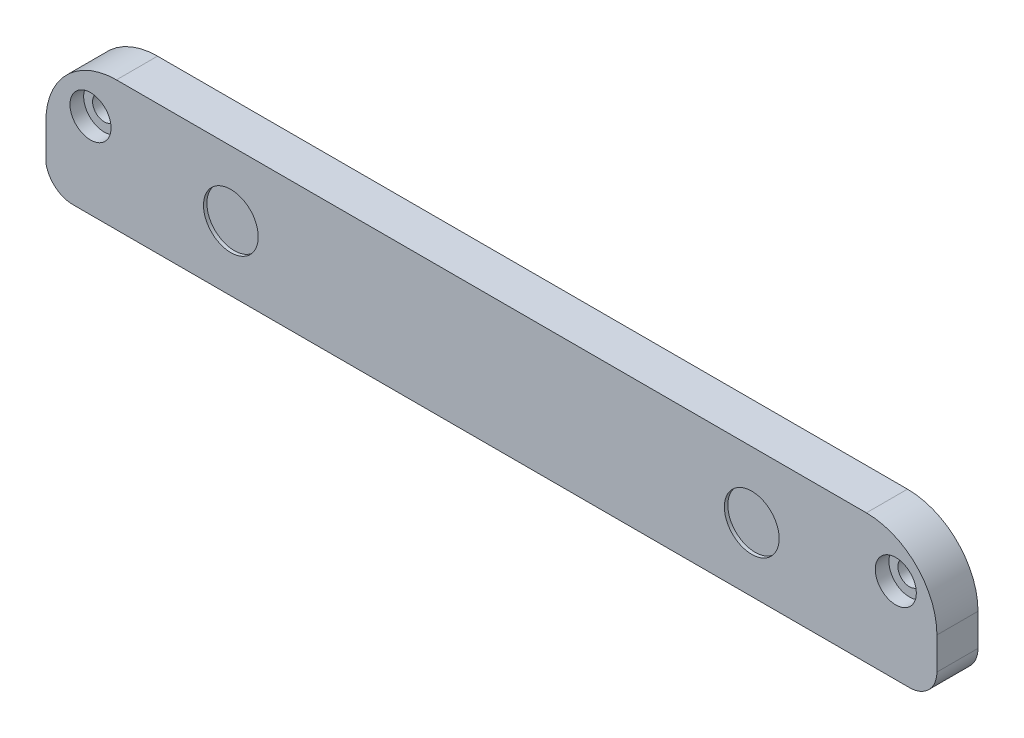
ISO-10303-21;
HEADER;
FILE_DESCRIPTION(('STEP AP214'),'2;1');
FILE_NAME('part.step','',(''),(''),'','','');
FILE_SCHEMA(('AUTOMOTIVE_DESIGN { 1 0 10303 214 1 1 1 1 }'));
ENDSEC;
DATA;
#1=APPLICATION_CONTEXT('core data for automotive mechanical design processes');
#2=APPLICATION_PROTOCOL_DEFINITION('international standard','automotive_design',2000,#1);
#3=PRODUCT_CONTEXT('',#1,'mechanical');
#4=PRODUCT('Part','Part','',(#3));
#5=PRODUCT_RELATED_PRODUCT_CATEGORY('part','',(#4));
#6=PRODUCT_DEFINITION_FORMATION('','',#4);
#7=PRODUCT_DEFINITION_CONTEXT('part definition',#1,'design');
#8=PRODUCT_DEFINITION('design','',#6,#7);
#9=PRODUCT_DEFINITION_SHAPE('','',#8);
#10=(LENGTH_UNIT() NAMED_UNIT(*) SI_UNIT(.MILLI.,.METRE.));
#11=(NAMED_UNIT(*) PLANE_ANGLE_UNIT() SI_UNIT($,.RADIAN.));
#12=(NAMED_UNIT(*) SI_UNIT($,.STERADIAN.) SOLID_ANGLE_UNIT());
#13=UNCERTAINTY_MEASURE_WITH_UNIT(LENGTH_MEASURE(1.E-05),#10,'distance_accuracy_value','');
#14=(GEOMETRIC_REPRESENTATION_CONTEXT(3) GLOBAL_UNCERTAINTY_ASSIGNED_CONTEXT((#13)) GLOBAL_UNIT_ASSIGNED_CONTEXT((#10,
#11,#12)) REPRESENTATION_CONTEXT('',''));
#15=CARTESIAN_POINT('',(0.,0.,0.));
#16=DIRECTION('',(0.,0.,1.));
#17=DIRECTION('',(1.,0.,0.));
#18=AXIS2_PLACEMENT_3D('',#15,#16,#17);
#19=CARTESIAN_POINT('',(-172.847423140113,-48.0905,6.));
#20=DIRECTION('',(0.,0.,-1.));
#21=DIRECTION('',(-1.,0.,0.));
#22=AXIS2_PLACEMENT_3D('',#19,#20,#21);
#23=CYLINDRICAL_SURFACE('',#22,1.70000000000001);
#24=CARTESIAN_POINT('',(-172.847423140113,-48.0905,0.));
#25=DIRECTION('',(0.,0.,1.));
#26=DIRECTION('',(1.,0.,0.));
#27=AXIS2_PLACEMENT_3D('',#24,#25,#26);
#28=CIRCLE('',#27,1.70000000000001);
#29=CARTESIAN_POINT('',(-171.147423140113,-48.0905,0.));
#30=VERTEX_POINT('',#29);
#31=EDGE_CURVE('E141',#30,#30,#28,.T.);
#32=ORIENTED_EDGE('',*,*,#31,.F.);
#33=EDGE_LOOP('',(#32));
#34=FACE_BOUND('',#33,.T.);
#35=CARTESIAN_POINT('',(-172.847423140113,-48.0905,4.));
#36=DIRECTION('',(0.,0.,1.));
#37=DIRECTION('',(1.,0.,0.));
#38=AXIS2_PLACEMENT_3D('',#35,#36,#37);
#39=CIRCLE('',#38,1.70000000000001);
#40=CARTESIAN_POINT('',(-171.147423140113,-48.0905,4.));
#41=VERTEX_POINT('',#40);
#42=EDGE_CURVE('E43',#41,#41,#39,.T.);
#43=ORIENTED_EDGE('',*,*,#42,.T.);
#44=EDGE_LOOP('',(#43));
#45=FACE_BOUND('',#44,.T.);
#46=ADVANCED_FACE('F39',(#34,#45),#23,.F.);
#47=CARTESIAN_POINT('',(-55.2338,-48.0905,6.));
#48=DIRECTION('',(0.,0.,-1.));
#49=DIRECTION('',(-1.,0.,0.));
#50=AXIS2_PLACEMENT_3D('',#47,#48,#49);
#51=CYLINDRICAL_SURFACE('',#50,1.7);
#52=CARTESIAN_POINT('',(-55.2338,-48.0905,0.));
#53=DIRECTION('',(0.,0.,1.));
#54=DIRECTION('',(1.,0.,0.));
#55=AXIS2_PLACEMENT_3D('',#52,#53,#54);
#56=CIRCLE('',#55,1.7);
#57=CARTESIAN_POINT('',(-53.5338,-48.0905,0.));
#58=VERTEX_POINT('',#57);
#59=EDGE_CURVE('E138',#58,#58,#56,.T.);
#60=ORIENTED_EDGE('',*,*,#59,.F.);
#61=EDGE_LOOP('',(#60));
#62=FACE_BOUND('',#61,.T.);
#63=CARTESIAN_POINT('',(-55.2338,-48.0905,4.));
#64=DIRECTION('',(0.,0.,1.));
#65=DIRECTION('',(1.,0.,0.));
#66=AXIS2_PLACEMENT_3D('',#63,#64,#65);
#67=CIRCLE('',#66,1.7);
#68=CARTESIAN_POINT('',(-53.5338,-48.0905,4.));
#69=VERTEX_POINT('',#68);
#70=EDGE_CURVE('E171',#69,#69,#67,.T.);
#71=ORIENTED_EDGE('',*,*,#70,.T.);
#72=EDGE_LOOP('',(#71));
#73=FACE_BOUND('',#72,.T.);
#74=ADVANCED_FACE('F41',(#62,#73),#51,.F.);
#75=CARTESIAN_POINT('',(0.,-41.5905,6.));
#76=DIRECTION('',(0.,-1.,0.));
#77=DIRECTION('',(0.,0.,-1.));
#78=AXIS2_PLACEMENT_3D('',#75,#76,#77);
#79=PLANE('',#78);
#80=DIRECTION('',(-1.,0.,0.));
#81=VECTOR('',#80,1.);
#82=CARTESIAN_POINT('',(0.,-41.5905,0.));
#83=LINE('',#82,#81);
#84=CARTESIAN_POINT('',(-59.5275,-41.5905,0.));
#85=VERTEX_POINT('',#84);
#86=CARTESIAN_POINT('',(-169.0581,-41.5905,0.));
#87=VERTEX_POINT('',#86);
#88=EDGE_CURVE('E145',#85,#87,#83,.T.);
#89=ORIENTED_EDGE('',*,*,#88,.T.);
#90=DIRECTION('',(0.,0.,-1.));
#91=VECTOR('',#90,1.);
#92=CARTESIAN_POINT('',(-169.0581,-41.5905,6.));
#93=LINE('',#92,#91);
#94=CARTESIAN_POINT('',(-169.0581,-41.5905,6.));
#95=VERTEX_POINT('',#94);
#96=EDGE_CURVE('E11',#95,#87,#93,.T.);
#97=ORIENTED_EDGE('',*,*,#96,.F.);
#98=DIRECTION('',(-1.,0.,0.));
#99=VECTOR('',#98,1.);
#100=CARTESIAN_POINT('',(0.,-41.5905,6.));
#101=LINE('',#100,#99);
#102=CARTESIAN_POINT('',(-59.5275,-41.5905,6.));
#103=VERTEX_POINT('',#102);
#104=EDGE_CURVE('E163',#103,#95,#101,.T.);
#105=ORIENTED_EDGE('',*,*,#104,.F.);
#106=DIRECTION('',(0.,0.,-1.));
#107=VECTOR('',#106,1.);
#108=CARTESIAN_POINT('',(-59.5275,-41.5905,6.));
#109=LINE('',#108,#107);
#110=EDGE_CURVE('E134',#103,#85,#109,.T.);
#111=ORIENTED_EDGE('',*,*,#110,.T.);
#112=EDGE_LOOP('',(#89,#97,#105,#111));
#113=FACE_BOUND('',#112,.T.);
#114=ADVANCED_FACE('F236',(#113),#79,.F.);
#115=CARTESIAN_POINT('',(-169.0581,-51.8916076077553,6.));
#116=DIRECTION('',(0.,0.,-1.));
#117=DIRECTION('',(-1.,0.,0.));
#118=AXIS2_PLACEMENT_3D('',#115,#116,#117);
#119=CYLINDRICAL_SURFACE('',#118,10.3011076077553);
#120=CARTESIAN_POINT('',(-169.0581,-51.8916076077553,0.));
#121=DIRECTION('',(0.,0.,1.));
#122=DIRECTION('',(1.,0.,0.));
#123=AXIS2_PLACEMENT_3D('',#120,#121,#122);
#124=CIRCLE('',#123,10.3011076077553);
#125=CARTESIAN_POINT('',(-179.347423140113,-52.3842,0.));
#126=VERTEX_POINT('',#125);
#127=EDGE_CURVE('E148',#87,#126,#124,.T.);
#128=ORIENTED_EDGE('',*,*,#127,.T.);
#129=DIRECTION('',(0.,0.,-1.));
#130=VECTOR('',#129,1.);
#131=CARTESIAN_POINT('',(-179.347423140113,-52.3842,6.));
#132=LINE('',#131,#130);
#133=CARTESIAN_POINT('',(-179.347423140113,-52.3842,6.));
#134=VERTEX_POINT('',#133);
#135=EDGE_CURVE('E49',#134,#126,#132,.T.);
#136=ORIENTED_EDGE('',*,*,#135,.F.);
#137=CARTESIAN_POINT('',(-169.0581,-51.8916076077553,6.));
#138=DIRECTION('',(0.,0.,1.));
#139=DIRECTION('',(1.,0.,0.));
#140=AXIS2_PLACEMENT_3D('',#137,#138,#139);
#141=CIRCLE('',#140,10.3011076077553);
#142=EDGE_CURVE('E97',#95,#134,#141,.T.);
#143=ORIENTED_EDGE('',*,*,#142,.F.);
#144=ORIENTED_EDGE('',*,*,#96,.T.);
#145=EDGE_LOOP('',(#128,#136,#143,#144));
#146=FACE_BOUND('',#145,.T.);
#147=ADVANCED_FACE('F243',(#146),#119,.T.);
#148=CARTESIAN_POINT('',(-179.347423140113,0.,6.));
#149=DIRECTION('',(-1.,0.,0.));
#150=DIRECTION('',(0.,0.,1.));
#151=AXIS2_PLACEMENT_3D('',#148,#149,#150);
#152=PLANE('',#151);
#153=DIRECTION('',(0.,1.,0.));
#154=VECTOR('',#153,1.);
#155=CARTESIAN_POINT('',(-179.347423140113,0.,0.));
#156=LINE('',#155,#154);
#157=CARTESIAN_POINT('',(-179.347423140113,-57.3168005828187,0.));
#158=VERTEX_POINT('',#157);
#159=EDGE_CURVE('E151',#158,#126,#156,.T.);
#160=ORIENTED_EDGE('',*,*,#159,.F.);
#161=DIRECTION('',(0.,0.,-1.));
#162=VECTOR('',#161,1.);
#163=CARTESIAN_POINT('',(-179.347423140113,-57.3168005828187,6.));
#164=LINE('',#163,#162);
#165=CARTESIAN_POINT('',(-179.347423140113,-57.3168005828187,6.));
#166=VERTEX_POINT('',#165);
#167=EDGE_CURVE('E169',#166,#158,#164,.T.);
#168=ORIENTED_EDGE('',*,*,#167,.F.);
#169=DIRECTION('',(0.,1.,0.));
#170=VECTOR('',#169,1.);
#171=CARTESIAN_POINT('',(-179.347423140113,0.,6.));
#172=LINE('',#171,#170);
#173=EDGE_CURVE('E204',#166,#134,#172,.T.);
#174=ORIENTED_EDGE('',*,*,#173,.T.);
#175=ORIENTED_EDGE('',*,*,#135,.T.);
#176=EDGE_LOOP('',(#160,#168,#174,#175));
#177=FACE_BOUND('',#176,.T.);
#178=ADVANCED_FACE('F215',(#177),#152,.T.);
#179=CARTESIAN_POINT('',(-175.42043130948,-56.5560541321912,6.));
#180=DIRECTION('',(0.,0.,-1.));
#181=DIRECTION('',(-1.,0.,0.));
#182=AXIS2_PLACEMENT_3D('',#179,#180,#181);
#183=CYLINDRICAL_SURFACE('',#182,4.00000000000001);
#184=CARTESIAN_POINT('',(-175.42043130948,-56.5560541321912,0.));
#185=DIRECTION('',(0.,0.,1.));
#186=DIRECTION('',(1.,0.,0.));
#187=AXIS2_PLACEMENT_3D('',#184,#185,#186);
#188=CIRCLE('',#187,4.00000000000001);
#189=CARTESIAN_POINT('',(-175.42043130948,-60.5560541321912,0.));
#190=VERTEX_POINT('',#189);
#191=EDGE_CURVE('E154',#190,#158,#188,.F.);
#192=ORIENTED_EDGE('',*,*,#191,.F.);
#193=DIRECTION('',(0.,0.,-1.));
#194=VECTOR('',#193,1.);
#195=CARTESIAN_POINT('',(-175.42043130948,-60.5560541321912,6.));
#196=LINE('',#195,#194);
#197=CARTESIAN_POINT('',(-175.42043130948,-60.5560541321912,6.));
#198=VERTEX_POINT('',#197);
#199=EDGE_CURVE('E167',#198,#190,#196,.T.);
#200=ORIENTED_EDGE('',*,*,#199,.F.);
#201=CARTESIAN_POINT('',(-175.42043130948,-56.5560541321912,6.));
#202=DIRECTION('',(0.,0.,1.));
#203=DIRECTION('',(1.,0.,0.));
#204=AXIS2_PLACEMENT_3D('',#201,#202,#203);
#205=CIRCLE('',#204,4.00000000000001);
#206=EDGE_CURVE('E207',#198,#166,#205,.F.);
#207=ORIENTED_EDGE('',*,*,#206,.T.);
#208=ORIENTED_EDGE('',*,*,#167,.T.);
#209=EDGE_LOOP('',(#192,#200,#207,#208));
#210=FACE_BOUND('',#209,.T.);
#211=ADVANCED_FACE('F211',(#210),#183,.T.);
#212=CARTESIAN_POINT('',(0.,-60.5560541321912,6.));
#213=DIRECTION('',(0.,1.,0.));
#214=DIRECTION('',(0.,0.,1.));
#215=AXIS2_PLACEMENT_3D('',#212,#213,#214);
#216=PLANE('',#215);
#217=DIRECTION('',(1.,0.,0.));
#218=VECTOR('',#217,1.);
#219=CARTESIAN_POINT('',(0.,-60.5560541321912,0.));
#220=LINE('',#219,#218);
#221=CARTESIAN_POINT('',(-53.2274211960361,-60.5560541321912,0.));
#222=VERTEX_POINT('',#221);
#223=EDGE_CURVE('E157',#190,#222,#220,.T.);
#224=ORIENTED_EDGE('',*,*,#223,.T.);
#225=DIRECTION('',(0.,0.,-1.));
#226=VECTOR('',#225,1.);
#227=CARTESIAN_POINT('',(-53.2274211960361,-60.5560541321912,6.));
#228=LINE('',#227,#226);
#229=CARTESIAN_POINT('',(-53.2274211960361,-60.5560541321912,6.));
#230=VERTEX_POINT('',#229);
#231=EDGE_CURVE('E130',#230,#222,#228,.T.);
#232=ORIENTED_EDGE('',*,*,#231,.F.);
#233=DIRECTION('',(1.,0.,0.));
#234=VECTOR('',#233,1.);
#235=CARTESIAN_POINT('',(0.,-60.5560541321912,6.));
#236=LINE('',#235,#234);
#237=EDGE_CURVE('E117',#198,#230,#236,.T.);
#238=ORIENTED_EDGE('',*,*,#237,.F.);
#239=ORIENTED_EDGE('',*,*,#199,.T.);
#240=EDGE_LOOP('',(#224,#232,#238,#239));
#241=FACE_BOUND('',#240,.T.);
#242=ADVANCED_FACE('F221',(#241),#216,.F.);
#243=CARTESIAN_POINT('',(-53.2274211960361,-56.5560541321912,6.));
#244=DIRECTION('',(0.,0.,-1.));
#245=DIRECTION('',(-1.,0.,0.));
#246=AXIS2_PLACEMENT_3D('',#243,#244,#245);
#247=CYLINDRICAL_SURFACE('',#246,4.);
#248=CARTESIAN_POINT('',(-53.2274211960361,-56.5560541321912,0.));
#249=DIRECTION('',(0.,0.,1.));
#250=DIRECTION('',(1.,0.,0.));
#251=AXIS2_PLACEMENT_3D('',#248,#249,#250);
#252=CIRCLE('',#251,4.);
#253=CARTESIAN_POINT('',(-49.2275,-56.5811624077488,0.));
#254=VERTEX_POINT('',#253);
#255=EDGE_CURVE('E126',#222,#254,#252,.T.);
#256=ORIENTED_EDGE('',*,*,#255,.T.);
#257=DIRECTION('',(0.,0.,-1.));
#258=VECTOR('',#257,1.);
#259=CARTESIAN_POINT('',(-49.2275,-56.5811624077488,6.));
#260=LINE('',#259,#258);
#261=CARTESIAN_POINT('',(-49.2275,-56.5811624077488,6.));
#262=VERTEX_POINT('',#261);
#263=EDGE_CURVE('E123',#262,#254,#260,.T.);
#264=ORIENTED_EDGE('',*,*,#263,.F.);
#265=CARTESIAN_POINT('',(-53.2274211960361,-56.5560541321912,6.));
#266=DIRECTION('',(0.,0.,1.));
#267=DIRECTION('',(1.,0.,0.));
#268=AXIS2_PLACEMENT_3D('',#265,#266,#267);
#269=CIRCLE('',#268,4.);
#270=EDGE_CURVE('E110',#230,#262,#269,.T.);
#271=ORIENTED_EDGE('',*,*,#270,.F.);
#272=ORIENTED_EDGE('',*,*,#231,.T.);
#273=EDGE_LOOP('',(#256,#264,#271,#272));
#274=FACE_BOUND('',#273,.T.);
#275=ADVANCED_FACE('F124',(#274),#247,.T.);
#276=CARTESIAN_POINT('',(-49.2275,0.,6.));
#277=DIRECTION('',(1.,0.,0.));
#278=DIRECTION('',(0.,0.,-1.));
#279=AXIS2_PLACEMENT_3D('',#276,#277,#278);
#280=PLANE('',#279);
#281=DIRECTION('',(0.,-1.,0.));
#282=VECTOR('',#281,1.);
#283=CARTESIAN_POINT('',(-49.2275,0.,0.));
#284=LINE('',#283,#282);
#285=CARTESIAN_POINT('',(-49.2275,-51.8905,0.));
#286=VERTEX_POINT('',#285);
#287=EDGE_CURVE('E160',#286,#254,#284,.T.);
#288=ORIENTED_EDGE('',*,*,#287,.F.);
#289=DIRECTION('',(0.,0.,-1.));
#290=VECTOR('',#289,1.);
#291=CARTESIAN_POINT('',(-49.2275,-51.8905,6.));
#292=LINE('',#291,#290);
#293=CARTESIAN_POINT('',(-49.2275,-51.8905,6.));
#294=VERTEX_POINT('',#293);
#295=EDGE_CURVE('E86',#294,#286,#292,.T.);
#296=ORIENTED_EDGE('',*,*,#295,.F.);
#297=DIRECTION('',(0.,-1.,0.));
#298=VECTOR('',#297,1.);
#299=CARTESIAN_POINT('',(-49.2275,0.,6.));
#300=LINE('',#299,#298);
#301=EDGE_CURVE('E114',#294,#262,#300,.T.);
#302=ORIENTED_EDGE('',*,*,#301,.T.);
#303=ORIENTED_EDGE('',*,*,#263,.T.);
#304=EDGE_LOOP('',(#288,#296,#302,#303));
#305=FACE_BOUND('',#304,.T.);
#306=ADVANCED_FACE('F132',(#305),#280,.T.);
#307=CARTESIAN_POINT('',(-59.5275,-51.8905,6.));
#308=DIRECTION('',(0.,0.,-1.));
#309=DIRECTION('',(-1.,0.,0.));
#310=AXIS2_PLACEMENT_3D('',#307,#308,#309);
#311=CYLINDRICAL_SURFACE('',#310,10.3);
#312=CARTESIAN_POINT('',(-59.5275,-51.8905,0.));
#313=DIRECTION('',(0.,0.,1.));
#314=DIRECTION('',(1.,0.,0.));
#315=AXIS2_PLACEMENT_3D('',#312,#313,#314);
#316=CIRCLE('',#315,10.3);
#317=EDGE_CURVE('E89',#286,#85,#316,.T.);
#318=ORIENTED_EDGE('',*,*,#317,.T.);
#319=ORIENTED_EDGE('',*,*,#110,.F.);
#320=CARTESIAN_POINT('',(-59.5275,-51.8905,6.));
#321=DIRECTION('',(0.,0.,1.));
#322=DIRECTION('',(1.,0.,0.));
#323=AXIS2_PLACEMENT_3D('',#320,#321,#322);
#324=CIRCLE('',#323,10.3);
#325=EDGE_CURVE('E58',#294,#103,#324,.T.);
#326=ORIENTED_EDGE('',*,*,#325,.F.);
#327=ORIENTED_EDGE('',*,*,#295,.T.);
#328=EDGE_LOOP('',(#318,#319,#326,#327));
#329=FACE_BOUND('',#328,.T.);
#330=ADVANCED_FACE('F275',(#329),#311,.T.);
#331=CARTESIAN_POINT('',(0.,0.,6.));
#332=DIRECTION('',(0.,0.,1.));
#333=DIRECTION('',(1.,0.,0.));
#334=AXIS2_PLACEMENT_3D('',#331,#332,#333);
#335=PLANE('',#334);
#336=CARTESIAN_POINT('',(-172.847423140113,-48.0905,6.));
#337=DIRECTION('',(0.,0.,1.));
#338=DIRECTION('',(1.,0.,0.));
#339=AXIS2_PLACEMENT_3D('',#336,#337,#338);
#340=CIRCLE('',#339,2.99999999999999);
#341=CARTESIAN_POINT('',(-169.847423140113,-48.0905,6.));
#342=VERTEX_POINT('',#341);
#343=EDGE_CURVE('E179',#342,#342,#340,.T.);
#344=ORIENTED_EDGE('',*,*,#343,.F.);
#345=EDGE_LOOP('',(#344));
#346=FACE_BOUND('',#345,.T.);
#347=CARTESIAN_POINT('',(-55.2338,-48.0905,6.));
#348=DIRECTION('',(0.,0.,1.));
#349=DIRECTION('',(1.,0.,0.));
#350=AXIS2_PLACEMENT_3D('',#347,#348,#349);
#351=CIRCLE('',#350,3.);
#352=CARTESIAN_POINT('',(-52.2338,-48.0905,6.));
#353=VERTEX_POINT('',#352);
#354=EDGE_CURVE('E189',#353,#353,#351,.T.);
#355=ORIENTED_EDGE('',*,*,#354,.F.);
#356=EDGE_LOOP('',(#355));
#357=FACE_BOUND('',#356,.T.);
#358=CARTESIAN_POINT('',(-152.347423140113,-51.0905,6.));
#359=DIRECTION('',(0.,0.,1.));
#360=DIRECTION('',(1.,0.,0.));
#361=AXIS2_PLACEMENT_3D('',#358,#359,#360);
#362=CIRCLE('',#361,3.99999999999999);
#363=CARTESIAN_POINT('',(-148.347423140113,-51.0905,6.));
#364=VERTEX_POINT('',#363);
#365=EDGE_CURVE('E194',#364,#364,#362,.T.);
#366=ORIENTED_EDGE('',*,*,#365,.F.);
#367=EDGE_LOOP('',(#366));
#368=FACE_BOUND('',#367,.T.);
#369=CARTESIAN_POINT('',(-76.2695645635439,-51.2153589225933,6.));
#370=DIRECTION('',(0.,0.,1.));
#371=DIRECTION('',(-1.,0.,0.));
#372=AXIS2_PLACEMENT_3D('',#369,#370,#371);
#373=CIRCLE('',#372,3.99999999999999);
#374=CARTESIAN_POINT('',(-80.2695645635439,-51.2153589225933,6.));
#375=VERTEX_POINT('',#374);
#376=EDGE_CURVE('E177',#375,#375,#373,.T.);
#377=ORIENTED_EDGE('',*,*,#376,.F.);
#378=EDGE_LOOP('',(#377));
#379=FACE_BOUND('',#378,.T.);
#380=ORIENTED_EDGE('',*,*,#104,.T.);
#381=ORIENTED_EDGE('',*,*,#142,.T.);
#382=ORIENTED_EDGE('',*,*,#173,.F.);
#383=ORIENTED_EDGE('',*,*,#206,.F.);
#384=ORIENTED_EDGE('',*,*,#237,.T.);
#385=ORIENTED_EDGE('',*,*,#270,.T.);
#386=ORIENTED_EDGE('',*,*,#301,.F.);
#387=ORIENTED_EDGE('',*,*,#325,.T.);
#388=EDGE_LOOP('',(#380,#381,#382,#383,#384,#385,#386,#387));
#389=FACE_BOUND('',#388,.T.);
#390=ADVANCED_FACE('F112',(#346,#357,#368,#379,#389),#335,.T.);
#391=CARTESIAN_POINT('',(0.,0.,0.));
#392=DIRECTION('',(0.,0.,1.));
#393=DIRECTION('',(1.,0.,0.));
#394=AXIS2_PLACEMENT_3D('',#391,#392,#393);
#395=PLANE('',#394);
#396=ORIENTED_EDGE('',*,*,#59,.T.);
#397=EDGE_LOOP('',(#396));
#398=FACE_BOUND('',#397,.T.);
#399=ORIENTED_EDGE('',*,*,#31,.T.);
#400=EDGE_LOOP('',(#399));
#401=FACE_BOUND('',#400,.T.);
#402=ORIENTED_EDGE('',*,*,#88,.F.);
#403=ORIENTED_EDGE('',*,*,#317,.F.);
#404=ORIENTED_EDGE('',*,*,#287,.T.);
#405=ORIENTED_EDGE('',*,*,#255,.F.);
#406=ORIENTED_EDGE('',*,*,#223,.F.);
#407=ORIENTED_EDGE('',*,*,#191,.T.);
#408=ORIENTED_EDGE('',*,*,#159,.T.);
#409=ORIENTED_EDGE('',*,*,#127,.F.);
#410=EDGE_LOOP('',(#402,#403,#404,#405,#406,#407,#408,#409));
#411=FACE_BOUND('',#410,.T.);
#412=ADVANCED_FACE('F219',(#398,#401,#411),#395,.F.);
#413=CARTESIAN_POINT('',(-76.2695645635439,-51.2153589225933,5.5));
#414=DIRECTION('',(0.,0.,1.));
#415=DIRECTION('',(1.,0.,0.));
#416=AXIS2_PLACEMENT_3D('',#413,#414,#415);
#417=CYLINDRICAL_SURFACE('',#416,3.99999999999999);
#418=CARTESIAN_POINT('',(-76.2695645635439,-51.2153589225933,5.5));
#419=DIRECTION('',(0.,0.,1.));
#420=DIRECTION('',(-1.,0.,0.));
#421=AXIS2_PLACEMENT_3D('',#418,#419,#420);
#422=CIRCLE('',#421,3.99999999999999);
#423=CARTESIAN_POINT('',(-80.2695645635439,-51.2153589225933,5.5));
#424=VERTEX_POINT('',#423);
#425=EDGE_CURVE('E197',#424,#424,#422,.T.);
#426=ORIENTED_EDGE('',*,*,#425,.F.);
#427=EDGE_LOOP('',(#426));
#428=FACE_BOUND('',#427,.T.);
#429=ORIENTED_EDGE('',*,*,#376,.T.);
#430=EDGE_LOOP('',(#429));
#431=FACE_BOUND('',#430,.T.);
#432=ADVANCED_FACE('F294',(#428,#431),#417,.F.);
#433=CARTESIAN_POINT('',(-76.2695645635439,-51.2153589225933,5.5));
#434=DIRECTION('',(0.,0.,-1.));
#435=DIRECTION('',(-1.,0.,0.));
#436=AXIS2_PLACEMENT_3D('',#433,#434,#435);
#437=PLANE('',#436);
#438=ORIENTED_EDGE('',*,*,#425,.T.);
#439=EDGE_LOOP('',(#438));
#440=FACE_BOUND('',#439,.T.);
#441=ADVANCED_FACE('F305',(#440),#437,.F.);
#442=CARTESIAN_POINT('',(-152.347423140113,-51.0905,5.5));
#443=DIRECTION('',(0.,0.,1.));
#444=DIRECTION('',(1.,0.,0.));
#445=AXIS2_PLACEMENT_3D('',#442,#443,#444);
#446=CYLINDRICAL_SURFACE('',#445,3.99999999999999);
#447=CARTESIAN_POINT('',(-152.347423140113,-51.0905,5.5));
#448=DIRECTION('',(0.,0.,1.));
#449=DIRECTION('',(1.,0.,0.));
#450=AXIS2_PLACEMENT_3D('',#447,#448,#449);
#451=CIRCLE('',#450,3.99999999999999);
#452=CARTESIAN_POINT('',(-148.347423140113,-51.0905,5.5));
#453=VERTEX_POINT('',#452);
#454=EDGE_CURVE('E142',#453,#453,#451,.T.);
#455=ORIENTED_EDGE('',*,*,#454,.F.);
#456=EDGE_LOOP('',(#455));
#457=FACE_BOUND('',#456,.T.);
#458=ORIENTED_EDGE('',*,*,#365,.T.);
#459=EDGE_LOOP('',(#458));
#460=FACE_BOUND('',#459,.T.);
#461=ADVANCED_FACE('F316',(#457,#460),#446,.F.);
#462=CARTESIAN_POINT('',(-152.347423140113,-51.0905,5.5));
#463=DIRECTION('',(0.,0.,1.));
#464=DIRECTION('',(1.,0.,0.));
#465=AXIS2_PLACEMENT_3D('',#462,#463,#464);
#466=PLANE('',#465);
#467=ORIENTED_EDGE('',*,*,#454,.T.);
#468=EDGE_LOOP('',(#467));
#469=FACE_BOUND('',#468,.T.);
#470=ADVANCED_FACE('F325',(#469),#466,.T.);
#471=CARTESIAN_POINT('',(-55.2338,-48.0905,4.));
#472=DIRECTION('',(0.,0.,1.));
#473=DIRECTION('',(1.,0.,0.));
#474=AXIS2_PLACEMENT_3D('',#471,#472,#473);
#475=CYLINDRICAL_SURFACE('',#474,3.);
#476=CARTESIAN_POINT('',(-55.2338,-48.0905,4.));
#477=DIRECTION('',(0.,0.,1.));
#478=DIRECTION('',(1.,0.,0.));
#479=AXIS2_PLACEMENT_3D('',#476,#477,#478);
#480=CIRCLE('',#479,3.);
#481=CARTESIAN_POINT('',(-52.2338,-48.0905,4.));
#482=VERTEX_POINT('',#481);
#483=EDGE_CURVE('E184',#482,#482,#480,.T.);
#484=ORIENTED_EDGE('',*,*,#483,.F.);
#485=EDGE_LOOP('',(#484));
#486=FACE_BOUND('',#485,.T.);
#487=ORIENTED_EDGE('',*,*,#354,.T.);
#488=EDGE_LOOP('',(#487));
#489=FACE_BOUND('',#488,.T.);
#490=ADVANCED_FACE('F334',(#486,#489),#475,.F.);
#491=CARTESIAN_POINT('',(-55.2338,-48.0905,4.));
#492=DIRECTION('',(0.,0.,1.));
#493=DIRECTION('',(1.,0.,0.));
#494=AXIS2_PLACEMENT_3D('',#491,#492,#493);
#495=PLANE('',#494);
#496=ORIENTED_EDGE('',*,*,#70,.F.);
#497=EDGE_LOOP('',(#496));
#498=FACE_BOUND('',#497,.T.);
#499=ORIENTED_EDGE('',*,*,#483,.T.);
#500=EDGE_LOOP('',(#499));
#501=FACE_BOUND('',#500,.T.);
#502=ADVANCED_FACE('F345',(#498,#501),#495,.T.);
#503=CARTESIAN_POINT('',(-172.847423140113,-48.0905,4.));
#504=DIRECTION('',(0.,0.,1.));
#505=DIRECTION('',(1.,0.,0.));
#506=AXIS2_PLACEMENT_3D('',#503,#504,#505);
#507=CYLINDRICAL_SURFACE('',#506,2.99999999999999);
#508=CARTESIAN_POINT('',(-172.847423140113,-48.0905,4.));
#509=DIRECTION('',(0.,0.,1.));
#510=DIRECTION('',(1.,0.,0.));
#511=AXIS2_PLACEMENT_3D('',#508,#509,#510);
#512=CIRCLE('',#511,2.99999999999999);
#513=CARTESIAN_POINT('',(-169.847423140113,-48.0905,4.));
#514=VERTEX_POINT('',#513);
#515=EDGE_CURVE('E173',#514,#514,#512,.T.);
#516=ORIENTED_EDGE('',*,*,#515,.F.);
#517=EDGE_LOOP('',(#516));
#518=FACE_BOUND('',#517,.T.);
#519=ORIENTED_EDGE('',*,*,#343,.T.);
#520=EDGE_LOOP('',(#519));
#521=FACE_BOUND('',#520,.T.);
#522=ADVANCED_FACE('F354',(#518,#521),#507,.F.);
#523=CARTESIAN_POINT('',(-172.847423140113,-48.0905,4.));
#524=DIRECTION('',(0.,0.,1.));
#525=DIRECTION('',(1.,0.,0.));
#526=AXIS2_PLACEMENT_3D('',#523,#524,#525);
#527=PLANE('',#526);
#528=ORIENTED_EDGE('',*,*,#42,.F.);
#529=EDGE_LOOP('',(#528));
#530=FACE_BOUND('',#529,.T.);
#531=ORIENTED_EDGE('',*,*,#515,.T.);
#532=EDGE_LOOP('',(#531));
#533=FACE_BOUND('',#532,.T.);
#534=ADVANCED_FACE('F362',(#530,#533),#527,.T.);
#535=CLOSED_SHELL('',(#46,#74,#114,#147,#178,#211,#242,#275,#306,#330,#390,#412,#432,#441,#461,
#470,#490,#502,#522,#534));
#536=MANIFOLD_SOLID_BREP('B2',#535);
#537=ADVANCED_BREP_SHAPE_REPRESENTATION('',(#18,#536),#14);
#538=SHAPE_DEFINITION_REPRESENTATION(#9,#537);
ENDSEC;
END-ISO-10303-21;
